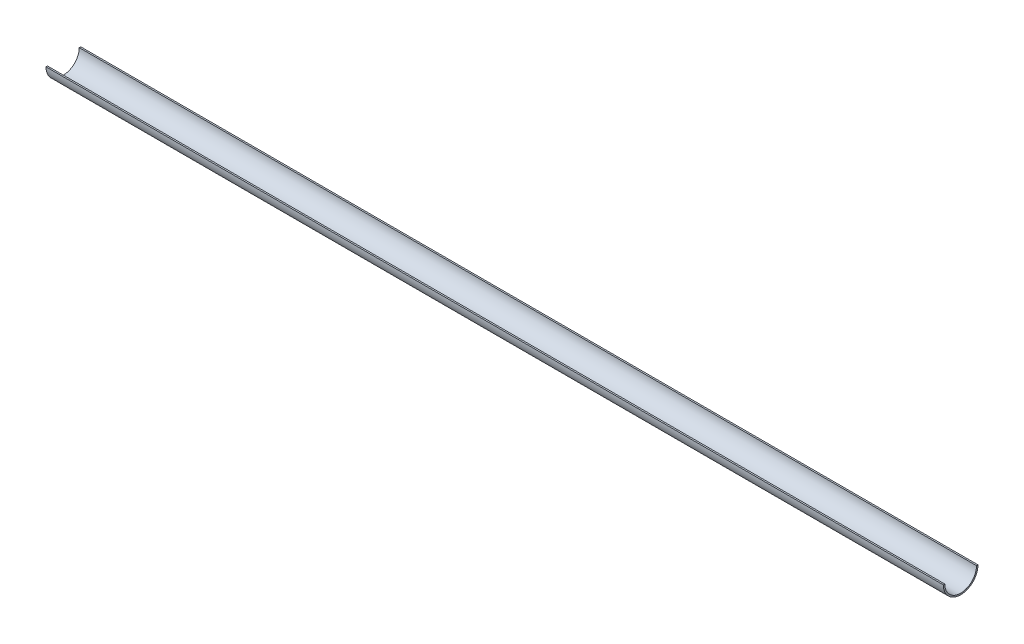
ISO-10303-21;
HEADER;
FILE_DESCRIPTION(('STEP AP214'),'2;1');
FILE_NAME('part.step','',(''),(''),'','','');
FILE_SCHEMA(('AUTOMOTIVE_DESIGN { 1 0 10303 214 1 1 1 1 }'));
ENDSEC;
DATA;
#1=APPLICATION_CONTEXT('core data for automotive mechanical design processes');
#2=APPLICATION_PROTOCOL_DEFINITION('international standard','automotive_design',2000,#1);
#3=PRODUCT_CONTEXT('',#1,'mechanical');
#4=PRODUCT('Part','Part','',(#3));
#5=PRODUCT_RELATED_PRODUCT_CATEGORY('part','',(#4));
#6=PRODUCT_DEFINITION_FORMATION('','',#4);
#7=PRODUCT_DEFINITION_CONTEXT('part definition',#1,'design');
#8=PRODUCT_DEFINITION('design','',#6,#7);
#9=PRODUCT_DEFINITION_SHAPE('','',#8);
#10=(LENGTH_UNIT() NAMED_UNIT(*) SI_UNIT(.MILLI.,.METRE.));
#11=(NAMED_UNIT(*) PLANE_ANGLE_UNIT() SI_UNIT($,.RADIAN.));
#12=(NAMED_UNIT(*) SI_UNIT($,.STERADIAN.) SOLID_ANGLE_UNIT());
#13=UNCERTAINTY_MEASURE_WITH_UNIT(LENGTH_MEASURE(1.E-05),#10,'distance_accuracy_value','');
#14=(GEOMETRIC_REPRESENTATION_CONTEXT(3) GLOBAL_UNCERTAINTY_ASSIGNED_CONTEXT((#13)) GLOBAL_UNIT_ASSIGNED_CONTEXT((#10,
#11,#12)) REPRESENTATION_CONTEXT('',''));
#15=CARTESIAN_POINT('',(0.,0.,0.));
#16=DIRECTION('',(0.,0.,1.));
#17=DIRECTION('',(1.,0.,0.));
#18=AXIS2_PLACEMENT_3D('',#15,#16,#17);
#19=CARTESIAN_POINT('',(6170.,0.,0.));
#20=DIRECTION('',(-1.,0.,0.));
#21=DIRECTION('',(0.,0.,1.));
#22=AXIS2_PLACEMENT_3D('',#19,#20,#21);
#23=CYLINDRICAL_SURFACE('',#22,119.253358771969);
#24=CARTESIAN_POINT('',(0.,0.,0.));
#25=DIRECTION('',(1.,0.,0.));
#26=DIRECTION('',(0.,0.,-1.));
#27=AXIS2_PLACEMENT_3D('',#24,#25,#26);
#28=CIRCLE('',#27,119.253358771969);
#29=CARTESIAN_POINT('',(0.,0.,119.253358771969));
#30=VERTEX_POINT('',#29);
#31=CARTESIAN_POINT('',(0.,0.,-119.253358771969));
#32=VERTEX_POINT('',#31);
#33=EDGE_CURVE('E98',#30,#32,#28,.T.);
#34=ORIENTED_EDGE('',*,*,#33,.T.);
#35=DIRECTION('',(-1.,0.,0.));
#36=VECTOR('',#35,1.);
#37=CARTESIAN_POINT('',(6170.,0.,-119.253358771969));
#38=LINE('',#37,#36);
#39=CARTESIAN_POINT('',(6170.,0.,-119.253358771969));
#40=VERTEX_POINT('',#39);
#41=EDGE_CURVE('E11',#40,#32,#38,.T.);
#42=ORIENTED_EDGE('',*,*,#41,.F.);
#43=CARTESIAN_POINT('',(6170.,0.,0.));
#44=DIRECTION('',(1.,0.,0.));
#45=DIRECTION('',(0.,0.,-1.));
#46=AXIS2_PLACEMENT_3D('',#43,#44,#45);
#47=CIRCLE('',#46,119.253358771969);
#48=CARTESIAN_POINT('',(6170.,0.,119.253358771969));
#49=VERTEX_POINT('',#48);
#50=EDGE_CURVE('E86',#49,#40,#47,.T.);
#51=ORIENTED_EDGE('',*,*,#50,.F.);
#52=DIRECTION('',(-1.,0.,0.));
#53=VECTOR('',#52,1.);
#54=CARTESIAN_POINT('',(6170.,0.,119.253358771969));
#55=LINE('',#54,#53);
#56=EDGE_CURVE('E94',#49,#30,#55,.T.);
#57=ORIENTED_EDGE('',*,*,#56,.T.);
#58=EDGE_LOOP('',(#34,#42,#51,#57));
#59=FACE_BOUND('',#58,.T.);
#60=ADVANCED_FACE('F35',(#59),#23,.T.);
#61=CARTESIAN_POINT('',(6170.,0.,-119.253358771969));
#62=DIRECTION('',(0.,-1.,0.));
#63=DIRECTION('',(0.,0.,-1.));
#64=AXIS2_PLACEMENT_3D('',#61,#62,#63);
#65=PLANE('',#64);
#66=DIRECTION('',(0.,0.,1.));
#67=VECTOR('',#66,1.);
#68=CARTESIAN_POINT('',(0.,0.,-119.253358771969));
#69=LINE('',#68,#67);
#70=CARTESIAN_POINT('',(0.,0.,-109.186516797712));
#71=VERTEX_POINT('',#70);
#72=EDGE_CURVE('E90',#32,#71,#69,.T.);
#73=ORIENTED_EDGE('',*,*,#72,.T.);
#74=DIRECTION('',(-1.,0.,0.));
#75=VECTOR('',#74,1.);
#76=CARTESIAN_POINT('',(6170.,0.,-109.186516797712));
#77=LINE('',#76,#75);
#78=CARTESIAN_POINT('',(6170.,0.,-109.186516797712));
#79=VERTEX_POINT('',#78);
#80=EDGE_CURVE('E43',#79,#71,#77,.T.);
#81=ORIENTED_EDGE('',*,*,#80,.F.);
#82=DIRECTION('',(0.,0.,1.));
#83=VECTOR('',#82,1.);
#84=CARTESIAN_POINT('',(6170.,0.,-119.253358771969));
#85=LINE('',#84,#83);
#86=EDGE_CURVE('E81',#40,#79,#85,.T.);
#87=ORIENTED_EDGE('',*,*,#86,.F.);
#88=ORIENTED_EDGE('',*,*,#41,.T.);
#89=EDGE_LOOP('',(#73,#81,#87,#88));
#90=FACE_BOUND('',#89,.T.);
#91=ADVANCED_FACE('F89',(#90),#65,.F.);
#92=CARTESIAN_POINT('',(6170.,0.,0.));
#93=DIRECTION('',(-1.,0.,0.));
#94=DIRECTION('',(0.,0.,1.));
#95=AXIS2_PLACEMENT_3D('',#92,#93,#94);
#96=CYLINDRICAL_SURFACE('',#95,109.186516797712);
#97=CARTESIAN_POINT('',(0.,0.,0.));
#98=DIRECTION('',(-1.,0.,0.));
#99=DIRECTION('',(0.,0.,-1.));
#100=AXIS2_PLACEMENT_3D('',#97,#98,#99);
#101=CIRCLE('',#100,109.186516797712);
#102=CARTESIAN_POINT('',(0.,0.,109.186516797712));
#103=VERTEX_POINT('',#102);
#104=EDGE_CURVE('E68',#71,#103,#101,.T.);
#105=ORIENTED_EDGE('',*,*,#104,.T.);
#106=DIRECTION('',(-1.,0.,0.));
#107=VECTOR('',#106,1.);
#108=CARTESIAN_POINT('',(6170.,0.,109.186516797712));
#109=LINE('',#108,#107);
#110=CARTESIAN_POINT('',(6170.,0.,109.186516797712));
#111=VERTEX_POINT('',#110);
#112=EDGE_CURVE('E91',#111,#103,#109,.T.);
#113=ORIENTED_EDGE('',*,*,#112,.F.);
#114=CARTESIAN_POINT('',(6170.,0.,0.));
#115=DIRECTION('',(-1.,0.,0.));
#116=DIRECTION('',(0.,0.,-1.));
#117=AXIS2_PLACEMENT_3D('',#114,#115,#116);
#118=CIRCLE('',#117,109.186516797712);
#119=EDGE_CURVE('E84',#79,#111,#118,.T.);
#120=ORIENTED_EDGE('',*,*,#119,.F.);
#121=ORIENTED_EDGE('',*,*,#80,.T.);
#122=EDGE_LOOP('',(#105,#113,#120,#121));
#123=FACE_BOUND('',#122,.T.);
#124=ADVANCED_FACE('F92',(#123),#96,.F.);
#125=CARTESIAN_POINT('',(6170.,0.,109.186516797712));
#126=DIRECTION('',(0.,-1.,0.));
#127=DIRECTION('',(0.,0.,-1.));
#128=AXIS2_PLACEMENT_3D('',#125,#126,#127);
#129=PLANE('',#128);
#130=DIRECTION('',(0.,0.,1.));
#131=VECTOR('',#130,1.);
#132=CARTESIAN_POINT('',(0.,0.,109.186516797712));
#133=LINE('',#132,#131);
#134=EDGE_CURVE('E74',#103,#30,#133,.T.);
#135=ORIENTED_EDGE('',*,*,#134,.T.);
#136=ORIENTED_EDGE('',*,*,#56,.F.);
#137=DIRECTION('',(0.,0.,1.));
#138=VECTOR('',#137,1.);
#139=CARTESIAN_POINT('',(6170.,0.,109.186516797712));
#140=LINE('',#139,#138);
#141=EDGE_CURVE('E51',#111,#49,#140,.T.);
#142=ORIENTED_EDGE('',*,*,#141,.F.);
#143=ORIENTED_EDGE('',*,*,#112,.T.);
#144=EDGE_LOOP('',(#135,#136,#142,#143));
#145=FACE_BOUND('',#144,.T.);
#146=ADVANCED_FACE('F105',(#145),#129,.F.);
#147=CARTESIAN_POINT('',(6170.,0.,0.));
#148=DIRECTION('',(1.,0.,0.));
#149=DIRECTION('',(0.,0.,-1.));
#150=AXIS2_PLACEMENT_3D('',#147,#148,#149);
#151=PLANE('',#150);
#152=ORIENTED_EDGE('',*,*,#50,.T.);
#153=ORIENTED_EDGE('',*,*,#86,.T.);
#154=ORIENTED_EDGE('',*,*,#119,.T.);
#155=ORIENTED_EDGE('',*,*,#141,.T.);
#156=EDGE_LOOP('',(#152,#153,#154,#155));
#157=FACE_BOUND('',#156,.T.);
#158=ADVANCED_FACE('F82',(#157),#151,.T.);
#159=CARTESIAN_POINT('',(0.,0.,0.));
#160=DIRECTION('',(1.,0.,0.));
#161=DIRECTION('',(0.,0.,-1.));
#162=AXIS2_PLACEMENT_3D('',#159,#160,#161);
#163=PLANE('',#162);
#164=ORIENTED_EDGE('',*,*,#33,.F.);
#165=ORIENTED_EDGE('',*,*,#134,.F.);
#166=ORIENTED_EDGE('',*,*,#104,.F.);
#167=ORIENTED_EDGE('',*,*,#72,.F.);
#168=EDGE_LOOP('',(#164,#165,#166,#167));
#169=FACE_BOUND('',#168,.T.);
#170=ADVANCED_FACE('F108',(#169),#163,.F.);
#171=CLOSED_SHELL('',(#60,#91,#124,#146,#158,#170));
#172=MANIFOLD_SOLID_BREP('B2',#171);
#173=ADVANCED_BREP_SHAPE_REPRESENTATION('',(#18,#172),#14);
#174=SHAPE_DEFINITION_REPRESENTATION(#9,#173);
ENDSEC;
END-ISO-10303-21;
